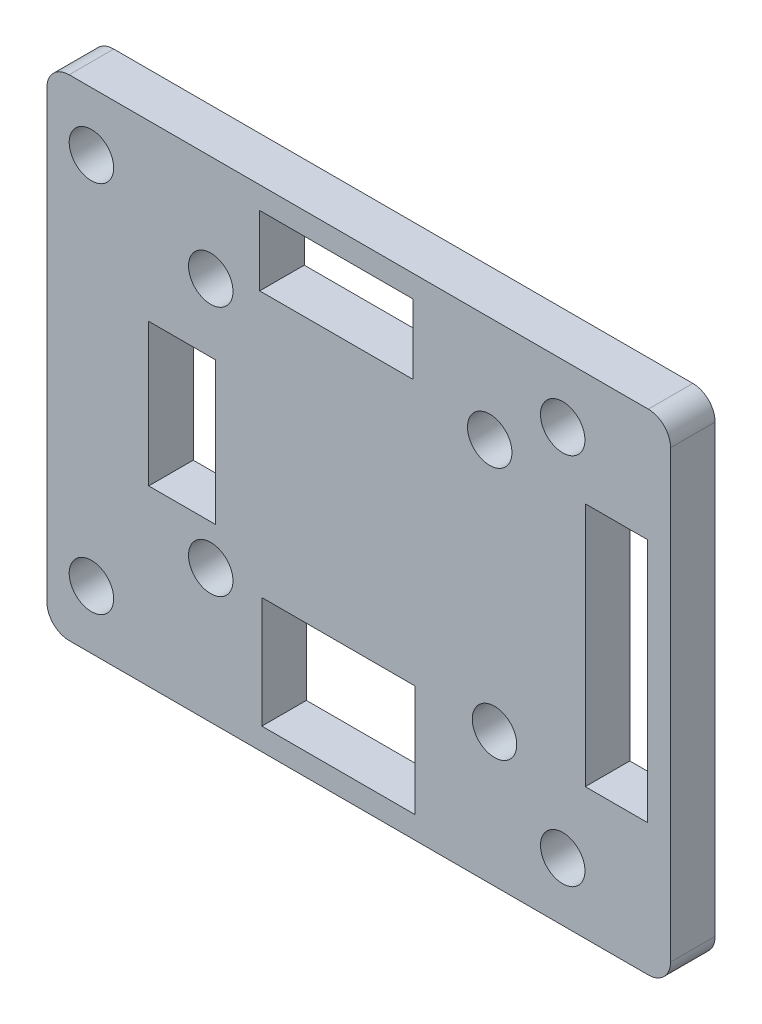
ISO-10303-21;
HEADER;
FILE_DESCRIPTION(('STEP AP214'),'2;1');
FILE_NAME('part.step','',(''),(''),'','','');
FILE_SCHEMA(('AUTOMOTIVE_DESIGN { 1 0 10303 214 1 1 1 1 }'));
ENDSEC;
DATA;
#1=APPLICATION_CONTEXT('core data for automotive mechanical design processes');
#2=APPLICATION_PROTOCOL_DEFINITION('international standard','automotive_design',2000,#1);
#3=PRODUCT_CONTEXT('',#1,'mechanical');
#4=PRODUCT('Part','Part','',(#3));
#5=PRODUCT_RELATED_PRODUCT_CATEGORY('part','',(#4));
#6=PRODUCT_DEFINITION_FORMATION('','',#4);
#7=PRODUCT_DEFINITION_CONTEXT('part definition',#1,'design');
#8=PRODUCT_DEFINITION('design','',#6,#7);
#9=PRODUCT_DEFINITION_SHAPE('','',#8);
#10=(LENGTH_UNIT() NAMED_UNIT(*) SI_UNIT(.MILLI.,.METRE.));
#11=(NAMED_UNIT(*) PLANE_ANGLE_UNIT() SI_UNIT($,.RADIAN.));
#12=(NAMED_UNIT(*) SI_UNIT($,.STERADIAN.) SOLID_ANGLE_UNIT());
#13=UNCERTAINTY_MEASURE_WITH_UNIT(LENGTH_MEASURE(1.E-05),#10,'distance_accuracy_value','');
#14=(GEOMETRIC_REPRESENTATION_CONTEXT(3) GLOBAL_UNCERTAINTY_ASSIGNED_CONTEXT((#13)) GLOBAL_UNIT_ASSIGNED_CONTEXT((#10,
#11,#12)) REPRESENTATION_CONTEXT('',''));
#15=CARTESIAN_POINT('',(0.,0.,0.));
#16=DIRECTION('',(0.,0.,1.));
#17=DIRECTION('',(1.,0.,0.));
#18=AXIS2_PLACEMENT_3D('',#15,#16,#17);
#19=CARTESIAN_POINT('',(0.,0.,2.54));
#20=DIRECTION('',(0.,0.,-1.));
#21=DIRECTION('',(-1.,0.,0.));
#22=AXIS2_PLACEMENT_3D('',#19,#20,#21);
#23=PLANE('',#22);
#24=DIRECTION('',(1.,0.,0.));
#25=VECTOR('',#24,1.);
#26=CARTESIAN_POINT('',(12.2564242404445,1.26999999999999,2.54));
#27=LINE('',#26,#25);
#28=CARTESIAN_POINT('',(12.2564242404445,1.26999999999999,2.54));
#29=VERTEX_POINT('',#28);
#30=CARTESIAN_POINT('',(20.9943307395216,1.26999999999999,2.54));
#31=VERTEX_POINT('',#30);
#32=EDGE_CURVE('E265',#29,#31,#27,.T.);
#33=ORIENTED_EDGE('',*,*,#32,.F.);
#34=DIRECTION('',(0.,-1.,0.));
#35=VECTOR('',#34,1.);
#36=CARTESIAN_POINT('',(12.2564242404445,7.61999999999998,2.54));
#37=LINE('',#36,#35);
#38=CARTESIAN_POINT('',(12.2564242404445,7.61999999999998,2.54));
#39=VERTEX_POINT('',#38);
#40=EDGE_CURVE('E276',#39,#29,#37,.T.);
#41=ORIENTED_EDGE('',*,*,#40,.F.);
#42=DIRECTION('',(-1.,0.,0.));
#43=VECTOR('',#42,1.);
#44=CARTESIAN_POINT('',(12.2564242404445,7.61999999999998,2.54));
#45=LINE('',#44,#43);
#46=CARTESIAN_POINT('',(20.9943307395216,7.61999999999998,2.54));
#47=VERTEX_POINT('',#46);
#48=EDGE_CURVE('E272',#47,#39,#45,.T.);
#49=ORIENTED_EDGE('',*,*,#48,.F.);
#50=DIRECTION('',(0.,1.,0.));
#51=VECTOR('',#50,1.);
#52=CARTESIAN_POINT('',(20.9943307395216,7.61999999999998,2.54));
#53=LINE('',#52,#51);
#54=EDGE_CURVE('E268',#31,#47,#53,.T.);
#55=ORIENTED_EDGE('',*,*,#54,.F.);
#56=EDGE_LOOP('',(#33,#41,#49,#55));
#57=FACE_BOUND('',#56,.T.);
#58=CARTESIAN_POINT('',(2.54,24.6087381577765,2.54));
#59=DIRECTION('',(0.,0.,1.));
#60=DIRECTION('',(1.,0.,0.));
#61=AXIS2_PLACEMENT_3D('',#58,#59,#60);
#62=CIRCLE('',#61,1.26751184222343);
#63=CARTESIAN_POINT('',(3.80751184222343,24.6087381577765,2.54));
#64=VERTEX_POINT('',#63);
#65=EDGE_CURVE('E351',#64,#64,#62,.T.);
#66=ORIENTED_EDGE('',*,*,#65,.F.);
#67=EDGE_LOOP('',(#66));
#68=FACE_BOUND('',#67,.T.);
#69=DIRECTION('',(1.,0.,0.));
#70=VECTOR('',#69,1.);
#71=CARTESIAN_POINT('',(34.2535356904248,7.50172230674273,2.54));
#72=LINE('',#71,#70);
#73=CARTESIAN_POINT('',(30.6975356904249,7.50172230674273,2.54));
#74=VERTEX_POINT('',#73);
#75=CARTESIAN_POINT('',(34.2535356904248,7.50172230674273,2.54));
#76=VERTEX_POINT('',#75);
#77=EDGE_CURVE('E359',#74,#76,#72,.T.);
#78=ORIENTED_EDGE('',*,*,#77,.F.);
#79=DIRECTION('',(0.,-1.,0.));
#80=VECTOR('',#79,1.);
#81=CARTESIAN_POINT('',(30.6975356904249,21.4717223067427,2.54));
#82=LINE('',#81,#80);
#83=CARTESIAN_POINT('',(30.6975356904249,21.4717223067427,2.54));
#84=VERTEX_POINT('',#83);
#85=EDGE_CURVE('E370',#84,#74,#82,.T.);
#86=ORIENTED_EDGE('',*,*,#85,.F.);
#87=DIRECTION('',(-1.,0.,0.));
#88=VECTOR('',#87,1.);
#89=CARTESIAN_POINT('',(30.6975356904249,21.4717223067427,2.54));
#90=LINE('',#89,#88);
#91=CARTESIAN_POINT('',(34.2535356904248,21.4717223067427,2.54));
#92=VERTEX_POINT('',#91);
#93=EDGE_CURVE('E366',#92,#84,#90,.T.);
#94=ORIENTED_EDGE('',*,*,#93,.F.);
#95=DIRECTION('',(0.,1.,0.));
#96=VECTOR('',#95,1.);
#97=CARTESIAN_POINT('',(34.2535356904248,21.4717223067427,2.54));
#98=LINE('',#97,#96);
#99=EDGE_CURVE('E362',#76,#92,#98,.T.);
#100=ORIENTED_EDGE('',*,*,#99,.F.);
#101=EDGE_LOOP('',(#78,#86,#94,#100));
#102=FACE_BOUND('',#101,.T.);
#103=DIRECTION('',(0.,1.,0.));
#104=VECTOR('',#103,1.);
#105=CARTESIAN_POINT('',(35.56,0.,2.54));
#106=LINE('',#105,#104);
#107=CARTESIAN_POINT('',(35.56,1.27,2.54));
#108=VERTEX_POINT('',#107);
#109=CARTESIAN_POINT('',(35.56,26.67,2.54));
#110=VERTEX_POINT('',#109);
#111=EDGE_CURVE('E409',#108,#110,#106,.T.);
#112=ORIENTED_EDGE('',*,*,#111,.T.);
#113=CARTESIAN_POINT('',(34.29,26.67,2.54));
#114=DIRECTION('',(0.,0.,-1.));
#115=DIRECTION('',(-1.,0.,0.));
#116=AXIS2_PLACEMENT_3D('',#113,#114,#115);
#117=CIRCLE('',#116,1.27);
#118=CARTESIAN_POINT('',(34.29,27.94,2.54));
#119=VERTEX_POINT('',#118);
#120=EDGE_CURVE('E464',#110,#119,#117,.F.);
#121=ORIENTED_EDGE('',*,*,#120,.T.);
#122=DIRECTION('',(-1.,0.,0.));
#123=VECTOR('',#122,1.);
#124=CARTESIAN_POINT('',(0.,27.94,2.54));
#125=LINE('',#124,#123);
#126=CARTESIAN_POINT('',(1.27,27.94,2.54));
#127=VERTEX_POINT('',#126);
#128=EDGE_CURVE('E413',#119,#127,#125,.T.);
#129=ORIENTED_EDGE('',*,*,#128,.T.);
#130=CARTESIAN_POINT('',(1.27,26.67,2.54));
#131=DIRECTION('',(0.,0.,-1.));
#132=DIRECTION('',(-1.,0.,0.));
#133=AXIS2_PLACEMENT_3D('',#130,#131,#132);
#134=CIRCLE('',#133,1.27);
#135=CARTESIAN_POINT('',(0.,26.67,2.54));
#136=VERTEX_POINT('',#135);
#137=EDGE_CURVE('E456',#127,#136,#134,.F.);
#138=ORIENTED_EDGE('',*,*,#137,.T.);
#139=DIRECTION('',(0.,-1.,0.));
#140=VECTOR('',#139,1.);
#141=CARTESIAN_POINT('',(0.,0.,2.54));
#142=LINE('',#141,#140);
#143=CARTESIAN_POINT('',(0.,1.27,2.54));
#144=VERTEX_POINT('',#143);
#145=EDGE_CURVE('E402',#136,#144,#142,.T.);
#146=ORIENTED_EDGE('',*,*,#145,.T.);
#147=CARTESIAN_POINT('',(1.27,1.27,2.54));
#148=DIRECTION('',(0.,0.,-1.));
#149=DIRECTION('',(-1.,0.,0.));
#150=AXIS2_PLACEMENT_3D('',#147,#148,#149);
#151=CIRCLE('',#150,1.27);
#152=CARTESIAN_POINT('',(1.27,0.,2.54));
#153=VERTEX_POINT('',#152);
#154=EDGE_CURVE('E68',#144,#153,#151,.F.);
#155=ORIENTED_EDGE('',*,*,#154,.T.);
#156=DIRECTION('',(1.,0.,0.));
#157=VECTOR('',#156,1.);
#158=CARTESIAN_POINT('',(0.,0.,2.54));
#159=LINE('',#158,#157);
#160=CARTESIAN_POINT('',(34.29,0.,2.54));
#161=VERTEX_POINT('',#160);
#162=EDGE_CURVE('E405',#153,#161,#159,.T.);
#163=ORIENTED_EDGE('',*,*,#162,.T.);
#164=CARTESIAN_POINT('',(34.29,1.27,2.54));
#165=DIRECTION('',(0.,0.,-1.));
#166=DIRECTION('',(-1.,0.,0.));
#167=AXIS2_PLACEMENT_3D('',#164,#165,#166);
#168=CIRCLE('',#167,1.27);
#169=EDGE_CURVE('E461',#161,#108,#168,.F.);
#170=ORIENTED_EDGE('',*,*,#169,.T.);
#171=EDGE_LOOP('',(#112,#121,#129,#138,#146,#155,#163,#170));
#172=FACE_BOUND('',#171,.T.);
#173=DIRECTION('',(0.,-1.,0.));
#174=VECTOR('',#173,1.);
#175=CARTESIAN_POINT('',(5.80594139998284,9.906,2.54));
#176=LINE('',#175,#174);
#177=CARTESIAN_POINT('',(5.80594139998284,18.034,2.54));
#178=VERTEX_POINT('',#177);
#179=CARTESIAN_POINT('',(5.80594139998284,9.906,2.54));
#180=VERTEX_POINT('',#179);
#181=EDGE_CURVE('E308',#178,#180,#176,.T.);
#182=ORIENTED_EDGE('',*,*,#181,.F.);
#183=DIRECTION('',(-1.,0.,0.));
#184=VECTOR('',#183,1.);
#185=CARTESIAN_POINT('',(5.80594139998284,18.034,2.54));
#186=LINE('',#185,#184);
#187=CARTESIAN_POINT('',(9.61594139998284,18.034,2.54));
#188=VERTEX_POINT('',#187);
#189=EDGE_CURVE('E319',#188,#178,#186,.T.);
#190=ORIENTED_EDGE('',*,*,#189,.F.);
#191=DIRECTION('',(0.,1.,0.));
#192=VECTOR('',#191,1.);
#193=CARTESIAN_POINT('',(9.61594139998284,18.034,2.54));
#194=LINE('',#193,#192);
#195=CARTESIAN_POINT('',(9.61594139998284,9.906,2.54));
#196=VERTEX_POINT('',#195);
#197=EDGE_CURVE('E315',#196,#188,#194,.T.);
#198=ORIENTED_EDGE('',*,*,#197,.F.);
#199=DIRECTION('',(1.,0.,0.));
#200=VECTOR('',#199,1.);
#201=CARTESIAN_POINT('',(9.61594139998284,9.906,2.54));
#202=LINE('',#201,#200);
#203=EDGE_CURVE('E311',#180,#196,#202,.T.);
#204=ORIENTED_EDGE('',*,*,#203,.F.);
#205=EDGE_LOOP('',(#182,#190,#198,#204));
#206=FACE_BOUND('',#205,.T.);
#207=DIRECTION('',(-1.,0.,0.));
#208=VECTOR('',#207,1.);
#209=CARTESIAN_POINT('',(12.1360807395216,26.67,2.54));
#210=LINE('',#209,#208);
#211=CARTESIAN_POINT('',(20.8673307395216,26.67,2.54));
#212=VERTEX_POINT('',#211);
#213=CARTESIAN_POINT('',(12.1360807395216,26.67,2.54));
#214=VERTEX_POINT('',#213);
#215=EDGE_CURVE('E209',#212,#214,#210,.T.);
#216=ORIENTED_EDGE('',*,*,#215,.F.);
#217=DIRECTION('',(0.,1.,0.));
#218=VECTOR('',#217,1.);
#219=CARTESIAN_POINT('',(20.8673307395216,26.67,2.54));
#220=LINE('',#219,#218);
#221=CARTESIAN_POINT('',(20.8673307395216,22.70125,2.54));
#222=VERTEX_POINT('',#221);
#223=EDGE_CURVE('E239',#222,#212,#220,.T.);
#224=ORIENTED_EDGE('',*,*,#223,.F.);
#225=DIRECTION('',(1.,0.,0.));
#226=VECTOR('',#225,1.);
#227=CARTESIAN_POINT('',(12.1360807395216,22.70125,2.54));
#228=LINE('',#227,#226);
#229=CARTESIAN_POINT('',(12.1360807395216,22.70125,2.54));
#230=VERTEX_POINT('',#229);
#231=EDGE_CURVE('E235',#230,#222,#228,.T.);
#232=ORIENTED_EDGE('',*,*,#231,.F.);
#233=DIRECTION('',(0.,-1.,0.));
#234=VECTOR('',#233,1.);
#235=CARTESIAN_POINT('',(12.1360807395216,26.67,2.54));
#236=LINE('',#235,#234);
#237=EDGE_CURVE('E220',#214,#230,#236,.T.);
#238=ORIENTED_EDGE('',*,*,#237,.F.);
#239=EDGE_LOOP('',(#216,#224,#232,#238));
#240=FACE_BOUND('',#239,.T.);
#241=CARTESIAN_POINT('',(25.2488307395216,21.9075,2.54));
#242=DIRECTION('',(0.,0.,1.));
#243=DIRECTION('',(-1.,0.,0.));
#244=AXIS2_PLACEMENT_3D('',#241,#242,#243);
#245=CIRCLE('',#244,1.26751184222344);
#246=CARTESIAN_POINT('',(23.9813188972981,21.9075,2.54));
#247=VERTEX_POINT('',#246);
#248=EDGE_CURVE('E248',#247,#247,#245,.T.);
#249=ORIENTED_EDGE('',*,*,#248,.F.);
#250=EDGE_LOOP('',(#249));
#251=FACE_BOUND('',#250,.T.);
#252=CARTESIAN_POINT('',(9.34208073952158,21.9075,2.54));
#253=DIRECTION('',(0.,0.,1.));
#254=DIRECTION('',(1.,0.,0.));
#255=AXIS2_PLACEMENT_3D('',#252,#253,#254);
#256=CIRCLE('',#255,1.26751184222344);
#257=CARTESIAN_POINT('',(10.609592581745,21.9075,2.54));
#258=VERTEX_POINT('',#257);
#259=EDGE_CURVE('E890',#258,#258,#256,.T.);
#260=ORIENTED_EDGE('',*,*,#259,.F.);
#261=EDGE_LOOP('',(#260));
#262=FACE_BOUND('',#261,.T.);
#263=CARTESIAN_POINT('',(29.4105688972981,24.6087381577765,2.54));
#264=DIRECTION('',(0.,0.,1.));
#265=DIRECTION('',(-1.,0.,0.));
#266=AXIS2_PLACEMENT_3D('',#263,#264,#265);
#267=CIRCLE('',#266,1.26751184222341);
#268=CARTESIAN_POINT('',(28.1430570550747,24.6087381577765,2.54));
#269=VERTEX_POINT('',#268);
#270=EDGE_CURVE('E883',#269,#269,#267,.T.);
#271=ORIENTED_EDGE('',*,*,#270,.F.);
#272=EDGE_LOOP('',(#271));
#273=FACE_BOUND('',#272,.T.);
#274=CARTESIAN_POINT('',(9.34208073952158,7.62,2.54));
#275=DIRECTION('',(0.,0.,1.));
#276=DIRECTION('',(1.,0.,0.));
#277=AXIS2_PLACEMENT_3D('',#274,#275,#276);
#278=CIRCLE('',#277,1.26751184222344);
#279=CARTESIAN_POINT('',(10.609592581745,7.62,2.54));
#280=VERTEX_POINT('',#279);
#281=EDGE_CURVE('E876',#280,#280,#278,.T.);
#282=ORIENTED_EDGE('',*,*,#281,.F.);
#283=EDGE_LOOP('',(#282));
#284=FACE_BOUND('',#283,.T.);
#285=CARTESIAN_POINT('',(2.54000000000001,3.33126184222345,2.54));
#286=DIRECTION('',(0.,0.,1.));
#287=DIRECTION('',(1.,0.,0.));
#288=AXIS2_PLACEMENT_3D('',#285,#286,#287);
#289=CIRCLE('',#288,1.26751184222344);
#290=CARTESIAN_POINT('',(3.80751184222345,3.33126184222345,2.54));
#291=VERTEX_POINT('',#290);
#292=EDGE_CURVE('E869',#291,#291,#289,.T.);
#293=ORIENTED_EDGE('',*,*,#292,.F.);
#294=EDGE_LOOP('',(#293));
#295=FACE_BOUND('',#294,.T.);
#296=CARTESIAN_POINT('',(29.4105688972981,3.33126184222345,2.54));
#297=DIRECTION('',(0.,0.,1.));
#298=DIRECTION('',(1.,0.,0.));
#299=AXIS2_PLACEMENT_3D('',#296,#297,#298);
#300=CIRCLE('',#299,1.26751184222341);
#301=CARTESIAN_POINT('',(30.6780807395216,3.33126184222345,2.54));
#302=VERTEX_POINT('',#301);
#303=EDGE_CURVE('E862',#302,#302,#300,.T.);
#304=ORIENTED_EDGE('',*,*,#303,.F.);
#305=EDGE_LOOP('',(#304));
#306=FACE_BOUND('',#305,.T.);
#307=CARTESIAN_POINT('',(25.5222856904249,7.62,2.54));
#308=DIRECTION('',(0.,0.,1.));
#309=DIRECTION('',(1.,0.,0.));
#310=AXIS2_PLACEMENT_3D('',#307,#308,#309);
#311=CIRCLE('',#310,1.26751184222344);
#312=CARTESIAN_POINT('',(26.7897975326484,7.62,2.54));
#313=VERTEX_POINT('',#312);
#314=EDGE_CURVE('E855',#313,#313,#311,.T.);
#315=ORIENTED_EDGE('',*,*,#314,.F.);
#316=EDGE_LOOP('',(#315));
#317=FACE_BOUND('',#316,.T.);
#318=ADVANCED_FACE('F45',(#57,#68,#102,#172,#206,#240,#251,#262,#273,#284,#295,#306,#317),#23,.F.);
#319=CARTESIAN_POINT('',(0.,0.,0.));
#320=DIRECTION('',(0.,0.,-1.));
#321=DIRECTION('',(-1.,0.,0.));
#322=AXIS2_PLACEMENT_3D('',#319,#320,#321);
#323=PLANE('',#322);
#324=CARTESIAN_POINT('',(29.4105688972981,3.33126184222345,0.));
#325=DIRECTION('',(0.,0.,1.));
#326=DIRECTION('',(1.,0.,0.));
#327=AXIS2_PLACEMENT_3D('',#324,#325,#326);
#328=CIRCLE('',#327,1.26751184222341);
#329=CARTESIAN_POINT('',(30.6780807395216,3.33126184222345,0.));
#330=VERTEX_POINT('',#329);
#331=EDGE_CURVE('E859',#330,#330,#328,.T.);
#332=ORIENTED_EDGE('',*,*,#331,.T.);
#333=EDGE_LOOP('',(#332));
#334=FACE_BOUND('',#333,.T.);
#335=CARTESIAN_POINT('',(9.34208073952158,7.62,0.));
#336=DIRECTION('',(0.,0.,1.));
#337=DIRECTION('',(1.,0.,0.));
#338=AXIS2_PLACEMENT_3D('',#335,#336,#337);
#339=CIRCLE('',#338,1.26751184222344);
#340=CARTESIAN_POINT('',(10.609592581745,7.62,0.));
#341=VERTEX_POINT('',#340);
#342=EDGE_CURVE('E873',#341,#341,#339,.T.);
#343=ORIENTED_EDGE('',*,*,#342,.T.);
#344=EDGE_LOOP('',(#343));
#345=FACE_BOUND('',#344,.T.);
#346=CARTESIAN_POINT('',(9.34208073952158,21.9075,0.));
#347=DIRECTION('',(0.,0.,1.));
#348=DIRECTION('',(1.,0.,0.));
#349=AXIS2_PLACEMENT_3D('',#346,#347,#348);
#350=CIRCLE('',#349,1.26751184222344);
#351=CARTESIAN_POINT('',(10.609592581745,21.9075,0.));
#352=VERTEX_POINT('',#351);
#353=EDGE_CURVE('E887',#352,#352,#350,.T.);
#354=ORIENTED_EDGE('',*,*,#353,.T.);
#355=EDGE_LOOP('',(#354));
#356=FACE_BOUND('',#355,.T.);
#357=DIRECTION('',(0.,1.,0.));
#358=VECTOR('',#357,1.);
#359=CARTESIAN_POINT('',(20.8673307395216,26.67,0.));
#360=LINE('',#359,#358);
#361=CARTESIAN_POINT('',(20.8673307395216,22.70125,0.));
#362=VERTEX_POINT('',#361);
#363=CARTESIAN_POINT('',(20.8673307395216,26.67,0.));
#364=VERTEX_POINT('',#363);
#365=EDGE_CURVE('E221',#362,#364,#360,.T.);
#366=ORIENTED_EDGE('',*,*,#365,.T.);
#367=DIRECTION('',(-1.,0.,0.));
#368=VECTOR('',#367,1.);
#369=CARTESIAN_POINT('',(12.1360807395216,26.67,0.));
#370=LINE('',#369,#368);
#371=CARTESIAN_POINT('',(12.1360807395216,26.67,0.));
#372=VERTEX_POINT('',#371);
#373=EDGE_CURVE('E245',#364,#372,#370,.T.);
#374=ORIENTED_EDGE('',*,*,#373,.T.);
#375=DIRECTION('',(0.,-1.,0.));
#376=VECTOR('',#375,1.);
#377=CARTESIAN_POINT('',(12.1360807395216,26.67,0.));
#378=LINE('',#377,#376);
#379=CARTESIAN_POINT('',(12.1360807395216,22.70125,0.));
#380=VERTEX_POINT('',#379);
#381=EDGE_CURVE('E227',#372,#380,#378,.T.);
#382=ORIENTED_EDGE('',*,*,#381,.T.);
#383=DIRECTION('',(1.,0.,0.));
#384=VECTOR('',#383,1.);
#385=CARTESIAN_POINT('',(12.1360807395216,22.70125,0.));
#386=LINE('',#385,#384);
#387=EDGE_CURVE('E251',#380,#362,#386,.T.);
#388=ORIENTED_EDGE('',*,*,#387,.T.);
#389=EDGE_LOOP('',(#366,#374,#382,#388));
#390=FACE_BOUND('',#389,.T.);
#391=DIRECTION('',(0.,-1.,0.));
#392=VECTOR('',#391,1.);
#393=CARTESIAN_POINT('',(12.2564242404445,7.61999999999998,0.));
#394=LINE('',#393,#392);
#395=CARTESIAN_POINT('',(12.2564242404445,7.61999999999998,0.));
#396=VERTEX_POINT('',#395);
#397=CARTESIAN_POINT('',(12.2564242404445,1.26999999999999,0.));
#398=VERTEX_POINT('',#397);
#399=EDGE_CURVE('E269',#396,#398,#394,.T.);
#400=ORIENTED_EDGE('',*,*,#399,.T.);
#401=DIRECTION('',(1.,0.,0.));
#402=VECTOR('',#401,1.);
#403=CARTESIAN_POINT('',(12.2564242404445,1.26999999999999,0.));
#404=LINE('',#403,#402);
#405=CARTESIAN_POINT('',(20.9943307395216,1.26999999999999,0.));
#406=VERTEX_POINT('',#405);
#407=EDGE_CURVE('E229',#398,#406,#404,.T.);
#408=ORIENTED_EDGE('',*,*,#407,.T.);
#409=DIRECTION('',(0.,1.,0.));
#410=VECTOR('',#409,1.);
#411=CARTESIAN_POINT('',(20.9943307395216,7.61999999999998,0.));
#412=LINE('',#411,#410);
#413=CARTESIAN_POINT('',(20.9943307395216,7.61999999999998,0.));
#414=VERTEX_POINT('',#413);
#415=EDGE_CURVE('E283',#406,#414,#412,.T.);
#416=ORIENTED_EDGE('',*,*,#415,.T.);
#417=DIRECTION('',(-1.,0.,0.));
#418=VECTOR('',#417,1.);
#419=CARTESIAN_POINT('',(12.2564242404445,7.61999999999998,0.));
#420=LINE('',#419,#418);
#421=EDGE_CURVE('E287',#414,#396,#420,.T.);
#422=ORIENTED_EDGE('',*,*,#421,.T.);
#423=EDGE_LOOP('',(#400,#408,#416,#422));
#424=FACE_BOUND('',#423,.T.);
#425=DIRECTION('',(-1.,0.,0.));
#426=VECTOR('',#425,1.);
#427=CARTESIAN_POINT('',(5.80594139998284,18.034,0.));
#428=LINE('',#427,#426);
#429=CARTESIAN_POINT('',(9.61594139998284,18.034,0.));
#430=VERTEX_POINT('',#429);
#431=CARTESIAN_POINT('',(5.80594139998284,18.034,0.));
#432=VERTEX_POINT('',#431);
#433=EDGE_CURVE('E312',#430,#432,#428,.T.);
#434=ORIENTED_EDGE('',*,*,#433,.T.);
#435=DIRECTION('',(0.,-1.,0.));
#436=VECTOR('',#435,1.);
#437=CARTESIAN_POINT('',(5.80594139998284,9.906,0.));
#438=LINE('',#437,#436);
#439=CARTESIAN_POINT('',(5.80594139998284,9.906,0.));
#440=VERTEX_POINT('',#439);
#441=EDGE_CURVE('E307',#432,#440,#438,.T.);
#442=ORIENTED_EDGE('',*,*,#441,.T.);
#443=DIRECTION('',(1.,0.,0.));
#444=VECTOR('',#443,1.);
#445=CARTESIAN_POINT('',(9.61594139998284,9.906,0.));
#446=LINE('',#445,#444);
#447=CARTESIAN_POINT('',(9.61594139998284,9.906,0.));
#448=VERTEX_POINT('',#447);
#449=EDGE_CURVE('E326',#440,#448,#446,.T.);
#450=ORIENTED_EDGE('',*,*,#449,.T.);
#451=DIRECTION('',(0.,1.,0.));
#452=VECTOR('',#451,1.);
#453=CARTESIAN_POINT('',(9.61594139998284,18.034,0.));
#454=LINE('',#453,#452);
#455=EDGE_CURVE('E330',#448,#430,#454,.T.);
#456=ORIENTED_EDGE('',*,*,#455,.T.);
#457=EDGE_LOOP('',(#434,#442,#450,#456));
#458=FACE_BOUND('',#457,.T.);
#459=CARTESIAN_POINT('',(2.54,24.6087381577765,0.));
#460=DIRECTION('',(0.,0.,1.));
#461=DIRECTION('',(1.,0.,0.));
#462=AXIS2_PLACEMENT_3D('',#459,#460,#461);
#463=CIRCLE('',#462,1.26751184222343);
#464=CARTESIAN_POINT('',(3.80751184222343,24.6087381577765,0.));
#465=VERTEX_POINT('',#464);
#466=EDGE_CURVE('E350',#465,#465,#463,.T.);
#467=ORIENTED_EDGE('',*,*,#466,.T.);
#468=EDGE_LOOP('',(#467));
#469=FACE_BOUND('',#468,.T.);
#470=DIRECTION('',(-1.,0.,0.));
#471=VECTOR('',#470,1.);
#472=CARTESIAN_POINT('',(0.,27.94,0.));
#473=LINE('',#472,#471);
#474=CARTESIAN_POINT('',(34.29,27.94,0.));
#475=VERTEX_POINT('',#474);
#476=CARTESIAN_POINT('',(1.27,27.94,0.));
#477=VERTEX_POINT('',#476);
#478=EDGE_CURVE('E406',#475,#477,#473,.T.);
#479=ORIENTED_EDGE('',*,*,#478,.F.);
#480=CARTESIAN_POINT('',(34.29,26.67,0.));
#481=DIRECTION('',(0.,0.,-1.));
#482=DIRECTION('',(-1.,0.,0.));
#483=AXIS2_PLACEMENT_3D('',#480,#481,#482);
#484=CIRCLE('',#483,1.27);
#485=CARTESIAN_POINT('',(35.56,26.67,0.));
#486=VERTEX_POINT('',#485);
#487=EDGE_CURVE('E446',#475,#486,#484,.T.);
#488=ORIENTED_EDGE('',*,*,#487,.T.);
#489=DIRECTION('',(0.,1.,0.));
#490=VECTOR('',#489,1.);
#491=CARTESIAN_POINT('',(35.56,0.,0.));
#492=LINE('',#491,#490);
#493=CARTESIAN_POINT('',(35.56,1.27,0.));
#494=VERTEX_POINT('',#493);
#495=EDGE_CURVE('E424',#494,#486,#492,.T.);
#496=ORIENTED_EDGE('',*,*,#495,.F.);
#497=CARTESIAN_POINT('',(34.29,1.27,0.));
#498=DIRECTION('',(0.,0.,-1.));
#499=DIRECTION('',(-1.,0.,0.));
#500=AXIS2_PLACEMENT_3D('',#497,#498,#499);
#501=CIRCLE('',#500,1.27);
#502=CARTESIAN_POINT('',(34.29,0.,0.));
#503=VERTEX_POINT('',#502);
#504=EDGE_CURVE('E443',#494,#503,#501,.T.);
#505=ORIENTED_EDGE('',*,*,#504,.T.);
#506=DIRECTION('',(1.,0.,0.));
#507=VECTOR('',#506,1.);
#508=CARTESIAN_POINT('',(0.,0.,0.));
#509=LINE('',#508,#507);
#510=CARTESIAN_POINT('',(1.27,0.,0.));
#511=VERTEX_POINT('',#510);
#512=EDGE_CURVE('E421',#511,#503,#509,.T.);
#513=ORIENTED_EDGE('',*,*,#512,.F.);
#514=CARTESIAN_POINT('',(1.27,1.27,0.));
#515=DIRECTION('',(0.,0.,-1.));
#516=DIRECTION('',(-1.,0.,0.));
#517=AXIS2_PLACEMENT_3D('',#514,#515,#516);
#518=CIRCLE('',#517,1.27);
#519=CARTESIAN_POINT('',(0.,1.27,0.));
#520=VERTEX_POINT('',#519);
#521=EDGE_CURVE('E440',#511,#520,#518,.T.);
#522=ORIENTED_EDGE('',*,*,#521,.T.);
#523=DIRECTION('',(0.,-1.,0.));
#524=VECTOR('',#523,1.);
#525=CARTESIAN_POINT('',(0.,0.,0.));
#526=LINE('',#525,#524);
#527=CARTESIAN_POINT('',(0.,26.67,0.));
#528=VERTEX_POINT('',#527);
#529=EDGE_CURVE('E401',#528,#520,#526,.T.);
#530=ORIENTED_EDGE('',*,*,#529,.F.);
#531=CARTESIAN_POINT('',(1.27,26.67,0.));
#532=DIRECTION('',(0.,0.,-1.));
#533=DIRECTION('',(-1.,0.,0.));
#534=AXIS2_PLACEMENT_3D('',#531,#532,#533);
#535=CIRCLE('',#534,1.27);
#536=EDGE_CURVE('E437',#528,#477,#535,.T.);
#537=ORIENTED_EDGE('',*,*,#536,.T.);
#538=EDGE_LOOP('',(#479,#488,#496,#505,#513,#522,#530,#537));
#539=FACE_BOUND('',#538,.T.);
#540=DIRECTION('',(0.,-1.,0.));
#541=VECTOR('',#540,1.);
#542=CARTESIAN_POINT('',(30.6975356904249,21.4717223067427,0.));
#543=LINE('',#542,#541);
#544=CARTESIAN_POINT('',(30.6975356904249,21.4717223067427,0.));
#545=VERTEX_POINT('',#544);
#546=CARTESIAN_POINT('',(30.6975356904249,7.50172230674273,0.));
#547=VERTEX_POINT('',#546);
#548=EDGE_CURVE('E363',#545,#547,#543,.T.);
#549=ORIENTED_EDGE('',*,*,#548,.T.);
#550=DIRECTION('',(1.,0.,0.));
#551=VECTOR('',#550,1.);
#552=CARTESIAN_POINT('',(34.2535356904248,7.50172230674273,0.));
#553=LINE('',#552,#551);
#554=CARTESIAN_POINT('',(34.2535356904248,7.50172230674273,0.));
#555=VERTEX_POINT('',#554);
#556=EDGE_CURVE('E355',#547,#555,#553,.T.);
#557=ORIENTED_EDGE('',*,*,#556,.T.);
#558=DIRECTION('',(0.,1.,0.));
#559=VECTOR('',#558,1.);
#560=CARTESIAN_POINT('',(34.2535356904248,21.4717223067427,0.));
#561=LINE('',#560,#559);
#562=CARTESIAN_POINT('',(34.2535356904248,21.4717223067427,0.));
#563=VERTEX_POINT('',#562);
#564=EDGE_CURVE('E377',#555,#563,#561,.T.);
#565=ORIENTED_EDGE('',*,*,#564,.T.);
#566=DIRECTION('',(-1.,0.,0.));
#567=VECTOR('',#566,1.);
#568=CARTESIAN_POINT('',(30.6975356904249,21.4717223067427,0.));
#569=LINE('',#568,#567);
#570=EDGE_CURVE('E381',#563,#545,#569,.T.);
#571=ORIENTED_EDGE('',*,*,#570,.T.);
#572=EDGE_LOOP('',(#549,#557,#565,#571));
#573=FACE_BOUND('',#572,.T.);
#574=CARTESIAN_POINT('',(25.2488307395216,21.9075,0.));
#575=DIRECTION('',(0.,0.,1.));
#576=DIRECTION('',(-1.,0.,0.));
#577=AXIS2_PLACEMENT_3D('',#574,#575,#576);
#578=CIRCLE('',#577,1.26751184222344);
#579=CARTESIAN_POINT('',(23.9813188972981,21.9075,0.));
#580=VERTEX_POINT('',#579);
#581=EDGE_CURVE('E841',#580,#580,#578,.T.);
#582=ORIENTED_EDGE('',*,*,#581,.T.);
#583=EDGE_LOOP('',(#582));
#584=FACE_BOUND('',#583,.T.);
#585=CARTESIAN_POINT('',(29.4105688972981,24.6087381577765,0.));
#586=DIRECTION('',(0.,0.,1.));
#587=DIRECTION('',(-1.,0.,0.));
#588=AXIS2_PLACEMENT_3D('',#585,#586,#587);
#589=CIRCLE('',#588,1.26751184222341);
#590=CARTESIAN_POINT('',(28.1430570550747,24.6087381577765,0.));
#591=VERTEX_POINT('',#590);
#592=EDGE_CURVE('E845',#591,#591,#589,.T.);
#593=ORIENTED_EDGE('',*,*,#592,.T.);
#594=EDGE_LOOP('',(#593));
#595=FACE_BOUND('',#594,.T.);
#596=CARTESIAN_POINT('',(2.54000000000001,3.33126184222345,0.));
#597=DIRECTION('',(0.,0.,1.));
#598=DIRECTION('',(1.,0.,0.));
#599=AXIS2_PLACEMENT_3D('',#596,#597,#598);
#600=CIRCLE('',#599,1.26751184222344);
#601=CARTESIAN_POINT('',(3.80751184222345,3.33126184222345,0.));
#602=VERTEX_POINT('',#601);
#603=EDGE_CURVE('E849',#602,#602,#600,.T.);
#604=ORIENTED_EDGE('',*,*,#603,.T.);
#605=EDGE_LOOP('',(#604));
#606=FACE_BOUND('',#605,.T.);
#607=CARTESIAN_POINT('',(25.5222856904249,7.62,0.));
#608=DIRECTION('',(0.,0.,1.));
#609=DIRECTION('',(1.,0.,0.));
#610=AXIS2_PLACEMENT_3D('',#607,#608,#609);
#611=CIRCLE('',#610,1.26751184222344);
#612=CARTESIAN_POINT('',(26.7897975326484,7.62,0.));
#613=VERTEX_POINT('',#612);
#614=EDGE_CURVE('E852',#613,#613,#611,.T.);
#615=ORIENTED_EDGE('',*,*,#614,.T.);
#616=EDGE_LOOP('',(#615));
#617=FACE_BOUND('',#616,.T.);
#618=ADVANCED_FACE('F484',(#334,#345,#356,#390,#424,#458,#469,#539,#573,#584,#595,#606,#617),
#323,.T.);
#619=CARTESIAN_POINT('',(0.,0.,2.54));
#620=DIRECTION('',(1.,0.,0.));
#621=DIRECTION('',(0.,0.,-1.));
#622=AXIS2_PLACEMENT_3D('',#619,#620,#621);
#623=PLANE('',#622);
#624=ORIENTED_EDGE('',*,*,#529,.T.);
#625=DIRECTION('',(0.,0.,-1.));
#626=VECTOR('',#625,1.);
#627=CARTESIAN_POINT('',(0.,1.27,2.54));
#628=LINE('',#627,#626);
#629=EDGE_CURVE('E11',#520,#144,#628,.F.);
#630=ORIENTED_EDGE('',*,*,#629,.T.);
#631=ORIENTED_EDGE('',*,*,#145,.F.);
#632=DIRECTION('',(0.,0.,-1.));
#633=VECTOR('',#632,1.);
#634=CARTESIAN_POINT('',(0.,26.67,2.54));
#635=LINE('',#634,#633);
#636=EDGE_CURVE('E54',#136,#528,#635,.T.);
#637=ORIENTED_EDGE('',*,*,#636,.T.);
#638=EDGE_LOOP('',(#624,#630,#631,#637));
#639=FACE_BOUND('',#638,.T.);
#640=ADVANCED_FACE('F478',(#639),#623,.F.);
#641=CARTESIAN_POINT('',(0.,0.,2.54));
#642=DIRECTION('',(0.,1.,0.));
#643=DIRECTION('',(-1.,0.,0.));
#644=AXIS2_PLACEMENT_3D('',#641,#642,#643);
#645=PLANE('',#644);
#646=ORIENTED_EDGE('',*,*,#512,.T.);
#647=DIRECTION('',(0.,0.,-1.));
#648=VECTOR('',#647,1.);
#649=CARTESIAN_POINT('',(34.29,0.,2.54));
#650=LINE('',#649,#648);
#651=EDGE_CURVE('E61',#503,#161,#650,.F.);
#652=ORIENTED_EDGE('',*,*,#651,.T.);
#653=ORIENTED_EDGE('',*,*,#162,.F.);
#654=DIRECTION('',(0.,0.,-1.));
#655=VECTOR('',#654,1.);
#656=CARTESIAN_POINT('',(1.27,0.,2.54));
#657=LINE('',#656,#655);
#658=EDGE_CURVE('E467',#153,#511,#657,.T.);
#659=ORIENTED_EDGE('',*,*,#658,.T.);
#660=EDGE_LOOP('',(#646,#652,#653,#659));
#661=FACE_BOUND('',#660,.T.);
#662=ADVANCED_FACE('F490',(#661),#645,.F.);
#663=CARTESIAN_POINT('',(35.56,0.,2.54));
#664=DIRECTION('',(-1.,0.,0.));
#665=DIRECTION('',(0.,0.,1.));
#666=AXIS2_PLACEMENT_3D('',#663,#664,#665);
#667=PLANE('',#666);
#668=ORIENTED_EDGE('',*,*,#495,.T.);
#669=DIRECTION('',(0.,0.,-1.));
#670=VECTOR('',#669,1.);
#671=CARTESIAN_POINT('',(35.56,26.67,2.54));
#672=LINE('',#671,#670);
#673=EDGE_CURVE('E453',#486,#110,#672,.F.);
#674=ORIENTED_EDGE('',*,*,#673,.T.);
#675=ORIENTED_EDGE('',*,*,#111,.F.);
#676=DIRECTION('',(0.,0.,-1.));
#677=VECTOR('',#676,1.);
#678=CARTESIAN_POINT('',(35.56,1.27,2.54));
#679=LINE('',#678,#677);
#680=EDGE_CURVE('E449',#108,#494,#679,.T.);
#681=ORIENTED_EDGE('',*,*,#680,.T.);
#682=EDGE_LOOP('',(#668,#674,#675,#681));
#683=FACE_BOUND('',#682,.T.);
#684=ADVANCED_FACE('F499',(#683),#667,.F.);
#685=CARTESIAN_POINT('',(0.,27.94,2.54));
#686=DIRECTION('',(0.,-1.,0.));
#687=DIRECTION('',(0.,0.,-1.));
#688=AXIS2_PLACEMENT_3D('',#685,#686,#687);
#689=PLANE('',#688);
#690=ORIENTED_EDGE('',*,*,#128,.F.);
#691=DIRECTION('',(0.,0.,-1.));
#692=VECTOR('',#691,1.);
#693=CARTESIAN_POINT('',(34.29,27.94,2.54));
#694=LINE('',#693,#692);
#695=EDGE_CURVE('E433',#119,#475,#694,.T.);
#696=ORIENTED_EDGE('',*,*,#695,.T.);
#697=ORIENTED_EDGE('',*,*,#478,.T.);
#698=DIRECTION('',(0.,0.,-1.));
#699=VECTOR('',#698,1.);
#700=CARTESIAN_POINT('',(1.27,27.94,2.54));
#701=LINE('',#700,#699);
#702=EDGE_CURVE('E417',#477,#127,#701,.F.);
#703=ORIENTED_EDGE('',*,*,#702,.T.);
#704=EDGE_LOOP('',(#690,#696,#697,#703));
#705=FACE_BOUND('',#704,.T.);
#706=ADVANCED_FACE('F507',(#705),#689,.F.);
#707=CARTESIAN_POINT('',(34.2535356904248,7.50172230674273,2.54));
#708=DIRECTION('',(0.,1.,0.));
#709=DIRECTION('',(-1.,0.,0.));
#710=AXIS2_PLACEMENT_3D('',#707,#708,#709);
#711=PLANE('',#710);
#712=ORIENTED_EDGE('',*,*,#556,.F.);
#713=DIRECTION('',(0.,0.,-1.));
#714=VECTOR('',#713,1.);
#715=CARTESIAN_POINT('',(30.6975356904249,7.50172230674273,2.54));
#716=LINE('',#715,#714);
#717=EDGE_CURVE('E373',#74,#547,#716,.T.);
#718=ORIENTED_EDGE('',*,*,#717,.F.);
#719=ORIENTED_EDGE('',*,*,#77,.T.);
#720=DIRECTION('',(0.,0.,-1.));
#721=VECTOR('',#720,1.);
#722=CARTESIAN_POINT('',(34.2535356904248,7.50172230674273,2.54));
#723=LINE('',#722,#721);
#724=EDGE_CURVE('E397',#76,#555,#723,.T.);
#725=ORIENTED_EDGE('',*,*,#724,.T.);
#726=EDGE_LOOP('',(#712,#718,#719,#725));
#727=FACE_BOUND('',#726,.T.);
#728=ADVANCED_FACE('F525',(#727),#711,.T.);
#729=CARTESIAN_POINT('',(34.2535356904248,21.4717223067427,2.54));
#730=DIRECTION('',(-1.,0.,0.));
#731=DIRECTION('',(0.,0.,1.));
#732=AXIS2_PLACEMENT_3D('',#729,#730,#731);
#733=PLANE('',#732);
#734=ORIENTED_EDGE('',*,*,#564,.F.);
#735=ORIENTED_EDGE('',*,*,#724,.F.);
#736=ORIENTED_EDGE('',*,*,#99,.T.);
#737=DIRECTION('',(0.,0.,-1.));
#738=VECTOR('',#737,1.);
#739=CARTESIAN_POINT('',(34.2535356904248,21.4717223067427,2.54));
#740=LINE('',#739,#738);
#741=EDGE_CURVE('E394',#92,#563,#740,.T.);
#742=ORIENTED_EDGE('',*,*,#741,.T.);
#743=EDGE_LOOP('',(#734,#735,#736,#742));
#744=FACE_BOUND('',#743,.T.);
#745=ADVANCED_FACE('F751',(#744),#733,.T.);
#746=CARTESIAN_POINT('',(30.6975356904249,21.4717223067427,2.54));
#747=DIRECTION('',(0.,-1.,0.));
#748=DIRECTION('',(0.,0.,-1.));
#749=AXIS2_PLACEMENT_3D('',#746,#747,#748);
#750=PLANE('',#749);
#751=ORIENTED_EDGE('',*,*,#570,.F.);
#752=ORIENTED_EDGE('',*,*,#741,.F.);
#753=ORIENTED_EDGE('',*,*,#93,.T.);
#754=DIRECTION('',(0.,0.,-1.));
#755=VECTOR('',#754,1.);
#756=CARTESIAN_POINT('',(30.6975356904249,21.4717223067427,2.54));
#757=LINE('',#756,#755);
#758=EDGE_CURVE('E391',#84,#545,#757,.T.);
#759=ORIENTED_EDGE('',*,*,#758,.T.);
#760=EDGE_LOOP('',(#751,#752,#753,#759));
#761=FACE_BOUND('',#760,.T.);
#762=ADVANCED_FACE('F742',(#761),#750,.T.);
#763=CARTESIAN_POINT('',(30.6975356904249,21.4717223067427,2.54));
#764=DIRECTION('',(1.,0.,0.));
#765=DIRECTION('',(0.,0.,-1.));
#766=AXIS2_PLACEMENT_3D('',#763,#764,#765);
#767=PLANE('',#766);
#768=ORIENTED_EDGE('',*,*,#548,.F.);
#769=ORIENTED_EDGE('',*,*,#758,.F.);
#770=ORIENTED_EDGE('',*,*,#85,.T.);
#771=ORIENTED_EDGE('',*,*,#717,.T.);
#772=EDGE_LOOP('',(#768,#769,#770,#771));
#773=FACE_BOUND('',#772,.T.);
#774=ADVANCED_FACE('F733',(#773),#767,.T.);
#775=CARTESIAN_POINT('',(2.54,24.6087381577765,2.54));
#776=DIRECTION('',(0.,0.,-1.));
#777=DIRECTION('',(-1.,0.,0.));
#778=AXIS2_PLACEMENT_3D('',#775,#776,#777);
#779=CYLINDRICAL_SURFACE('',#778,1.26751184222343);
#780=ORIENTED_EDGE('',*,*,#65,.T.);
#781=EDGE_LOOP('',(#780));
#782=FACE_BOUND('',#781,.T.);
#783=ORIENTED_EDGE('',*,*,#466,.F.);
#784=EDGE_LOOP('',(#783));
#785=FACE_BOUND('',#784,.T.);
#786=ADVANCED_FACE('F724',(#782,#785),#779,.F.);
#787=CARTESIAN_POINT('',(5.80594139998284,9.906,2.54));
#788=DIRECTION('',(1.,0.,0.));
#789=DIRECTION('',(0.,0.,-1.));
#790=AXIS2_PLACEMENT_3D('',#787,#788,#789);
#791=PLANE('',#790);
#792=ORIENTED_EDGE('',*,*,#441,.F.);
#793=DIRECTION('',(0.,0.,-1.));
#794=VECTOR('',#793,1.);
#795=CARTESIAN_POINT('',(5.80594139998284,18.034,2.54));
#796=LINE('',#795,#794);
#797=EDGE_CURVE('E322',#178,#432,#796,.T.);
#798=ORIENTED_EDGE('',*,*,#797,.F.);
#799=ORIENTED_EDGE('',*,*,#181,.T.);
#800=DIRECTION('',(0.,0.,-1.));
#801=VECTOR('',#800,1.);
#802=CARTESIAN_POINT('',(5.80594139998284,9.906,2.54));
#803=LINE('',#802,#801);
#804=EDGE_CURVE('E346',#180,#440,#803,.T.);
#805=ORIENTED_EDGE('',*,*,#804,.T.);
#806=EDGE_LOOP('',(#792,#798,#799,#805));
#807=FACE_BOUND('',#806,.T.);
#808=ADVANCED_FACE('F715',(#807),#791,.T.);
#809=CARTESIAN_POINT('',(9.61594139998284,9.906,2.54));
#810=DIRECTION('',(0.,1.,0.));
#811=DIRECTION('',(0.,0.,1.));
#812=AXIS2_PLACEMENT_3D('',#809,#810,#811);
#813=PLANE('',#812);
#814=ORIENTED_EDGE('',*,*,#449,.F.);
#815=ORIENTED_EDGE('',*,*,#804,.F.);
#816=ORIENTED_EDGE('',*,*,#203,.T.);
#817=DIRECTION('',(0.,0.,-1.));
#818=VECTOR('',#817,1.);
#819=CARTESIAN_POINT('',(9.61594139998284,9.906,2.54));
#820=LINE('',#819,#818);
#821=EDGE_CURVE('E343',#196,#448,#820,.T.);
#822=ORIENTED_EDGE('',*,*,#821,.T.);
#823=EDGE_LOOP('',(#814,#815,#816,#822));
#824=FACE_BOUND('',#823,.T.);
#825=ADVANCED_FACE('F706',(#824),#813,.T.);
#826=CARTESIAN_POINT('',(9.61594139998284,18.034,2.54));
#827=DIRECTION('',(-1.,0.,0.));
#828=DIRECTION('',(0.,0.,1.));
#829=AXIS2_PLACEMENT_3D('',#826,#827,#828);
#830=PLANE('',#829);
#831=ORIENTED_EDGE('',*,*,#455,.F.);
#832=ORIENTED_EDGE('',*,*,#821,.F.);
#833=ORIENTED_EDGE('',*,*,#197,.T.);
#834=DIRECTION('',(0.,0.,-1.));
#835=VECTOR('',#834,1.);
#836=CARTESIAN_POINT('',(9.61594139998284,18.034,2.54));
#837=LINE('',#836,#835);
#838=EDGE_CURVE('E340',#188,#430,#837,.T.);
#839=ORIENTED_EDGE('',*,*,#838,.T.);
#840=EDGE_LOOP('',(#831,#832,#833,#839));
#841=FACE_BOUND('',#840,.T.);
#842=ADVANCED_FACE('F697',(#841),#830,.T.);
#843=CARTESIAN_POINT('',(5.80594139998284,18.034,2.54));
#844=DIRECTION('',(0.,-1.,0.));
#845=DIRECTION('',(0.,0.,-1.));
#846=AXIS2_PLACEMENT_3D('',#843,#844,#845);
#847=PLANE('',#846);
#848=ORIENTED_EDGE('',*,*,#433,.F.);
#849=ORIENTED_EDGE('',*,*,#838,.F.);
#850=ORIENTED_EDGE('',*,*,#189,.T.);
#851=ORIENTED_EDGE('',*,*,#797,.T.);
#852=EDGE_LOOP('',(#848,#849,#850,#851));
#853=FACE_BOUND('',#852,.T.);
#854=ADVANCED_FACE('F688',(#853),#847,.T.);
#855=CARTESIAN_POINT('',(12.2564242404445,1.26999999999999,2.54));
#856=DIRECTION('',(0.,1.,0.));
#857=DIRECTION('',(0.,0.,1.));
#858=AXIS2_PLACEMENT_3D('',#855,#856,#857);
#859=PLANE('',#858);
#860=ORIENTED_EDGE('',*,*,#407,.F.);
#861=DIRECTION('',(0.,0.,-1.));
#862=VECTOR('',#861,1.);
#863=CARTESIAN_POINT('',(12.2564242404445,1.26999999999999,2.54));
#864=LINE('',#863,#862);
#865=EDGE_CURVE('E279',#29,#398,#864,.T.);
#866=ORIENTED_EDGE('',*,*,#865,.F.);
#867=ORIENTED_EDGE('',*,*,#32,.T.);
#868=DIRECTION('',(0.,0.,-1.));
#869=VECTOR('',#868,1.);
#870=CARTESIAN_POINT('',(20.9943307395216,1.26999999999999,2.54));
#871=LINE('',#870,#869);
#872=EDGE_CURVE('E303',#31,#406,#871,.T.);
#873=ORIENTED_EDGE('',*,*,#872,.T.);
#874=EDGE_LOOP('',(#860,#866,#867,#873));
#875=FACE_BOUND('',#874,.T.);
#876=ADVANCED_FACE('F679',(#875),#859,.T.);
#877=CARTESIAN_POINT('',(20.9943307395216,7.61999999999998,2.54));
#878=DIRECTION('',(-1.,0.,0.));
#879=DIRECTION('',(0.,0.,1.));
#880=AXIS2_PLACEMENT_3D('',#877,#878,#879);
#881=PLANE('',#880);
#882=ORIENTED_EDGE('',*,*,#415,.F.);
#883=ORIENTED_EDGE('',*,*,#872,.F.);
#884=ORIENTED_EDGE('',*,*,#54,.T.);
#885=DIRECTION('',(0.,0.,-1.));
#886=VECTOR('',#885,1.);
#887=CARTESIAN_POINT('',(20.9943307395216,7.61999999999998,2.54));
#888=LINE('',#887,#886);
#889=EDGE_CURVE('E300',#47,#414,#888,.T.);
#890=ORIENTED_EDGE('',*,*,#889,.T.);
#891=EDGE_LOOP('',(#882,#883,#884,#890));
#892=FACE_BOUND('',#891,.T.);
#893=ADVANCED_FACE('F670',(#892),#881,.T.);
#894=CARTESIAN_POINT('',(12.2564242404445,7.61999999999998,2.54));
#895=DIRECTION('',(0.,-1.,0.));
#896=DIRECTION('',(1.,0.,0.));
#897=AXIS2_PLACEMENT_3D('',#894,#895,#896);
#898=PLANE('',#897);
#899=ORIENTED_EDGE('',*,*,#421,.F.);
#900=ORIENTED_EDGE('',*,*,#889,.F.);
#901=ORIENTED_EDGE('',*,*,#48,.T.);
#902=DIRECTION('',(0.,0.,-1.));
#903=VECTOR('',#902,1.);
#904=CARTESIAN_POINT('',(12.2564242404445,7.61999999999998,2.54));
#905=LINE('',#904,#903);
#906=EDGE_CURVE('E297',#39,#396,#905,.T.);
#907=ORIENTED_EDGE('',*,*,#906,.T.);
#908=EDGE_LOOP('',(#899,#900,#901,#907));
#909=FACE_BOUND('',#908,.T.);
#910=ADVANCED_FACE('F661',(#909),#898,.T.);
#911=CARTESIAN_POINT('',(12.2564242404445,7.61999999999998,2.54));
#912=DIRECTION('',(1.,0.,0.));
#913=DIRECTION('',(0.,0.,-1.));
#914=AXIS2_PLACEMENT_3D('',#911,#912,#913);
#915=PLANE('',#914);
#916=ORIENTED_EDGE('',*,*,#399,.F.);
#917=ORIENTED_EDGE('',*,*,#906,.F.);
#918=ORIENTED_EDGE('',*,*,#40,.T.);
#919=ORIENTED_EDGE('',*,*,#865,.T.);
#920=EDGE_LOOP('',(#916,#917,#918,#919));
#921=FACE_BOUND('',#920,.T.);
#922=ADVANCED_FACE('F653',(#921),#915,.T.);
#923=CARTESIAN_POINT('',(12.1360807395216,26.67,2.54));
#924=DIRECTION('',(0.,-1.,0.));
#925=DIRECTION('',(0.,0.,-1.));
#926=AXIS2_PLACEMENT_3D('',#923,#924,#925);
#927=PLANE('',#926);
#928=ORIENTED_EDGE('',*,*,#373,.F.);
#929=DIRECTION('',(0.,0.,-1.));
#930=VECTOR('',#929,1.);
#931=CARTESIAN_POINT('',(20.8673307395216,26.67,2.54));
#932=LINE('',#931,#930);
#933=EDGE_CURVE('E215',#212,#364,#932,.T.);
#934=ORIENTED_EDGE('',*,*,#933,.F.);
#935=ORIENTED_EDGE('',*,*,#215,.T.);
#936=DIRECTION('',(0.,0.,-1.));
#937=VECTOR('',#936,1.);
#938=CARTESIAN_POINT('',(12.1360807395216,26.67,2.54));
#939=LINE('',#938,#937);
#940=EDGE_CURVE('E212',#214,#372,#939,.T.);
#941=ORIENTED_EDGE('',*,*,#940,.T.);
#942=EDGE_LOOP('',(#928,#934,#935,#941));
#943=FACE_BOUND('',#942,.T.);
#944=ADVANCED_FACE('F211',(#943),#927,.T.);
#945=CARTESIAN_POINT('',(12.1360807395216,26.67,2.54));
#946=DIRECTION('',(1.,0.,0.));
#947=DIRECTION('',(0.,0.,-1.));
#948=AXIS2_PLACEMENT_3D('',#945,#946,#947);
#949=PLANE('',#948);
#950=ORIENTED_EDGE('',*,*,#381,.F.);
#951=ORIENTED_EDGE('',*,*,#940,.F.);
#952=ORIENTED_EDGE('',*,*,#237,.T.);
#953=DIRECTION('',(0.,0.,-1.));
#954=VECTOR('',#953,1.);
#955=CARTESIAN_POINT('',(12.1360807395216,22.70125,2.54));
#956=LINE('',#955,#954);
#957=EDGE_CURVE('E230',#230,#380,#956,.T.);
#958=ORIENTED_EDGE('',*,*,#957,.T.);
#959=EDGE_LOOP('',(#950,#951,#952,#958));
#960=FACE_BOUND('',#959,.T.);
#961=ADVANCED_FACE('F224',(#960),#949,.T.);
#962=CARTESIAN_POINT('',(12.1360807395216,22.70125,2.54));
#963=DIRECTION('',(0.,1.,0.));
#964=DIRECTION('',(0.,0.,1.));
#965=AXIS2_PLACEMENT_3D('',#962,#963,#964);
#966=PLANE('',#965);
#967=ORIENTED_EDGE('',*,*,#387,.F.);
#968=ORIENTED_EDGE('',*,*,#957,.F.);
#969=ORIENTED_EDGE('',*,*,#231,.T.);
#970=DIRECTION('',(0.,0.,-1.));
#971=VECTOR('',#970,1.);
#972=CARTESIAN_POINT('',(20.8673307395216,22.70125,2.54));
#973=LINE('',#972,#971);
#974=EDGE_CURVE('E260',#222,#362,#973,.T.);
#975=ORIENTED_EDGE('',*,*,#974,.T.);
#976=EDGE_LOOP('',(#967,#968,#969,#975));
#977=FACE_BOUND('',#976,.T.);
#978=ADVANCED_FACE('F629',(#977),#966,.T.);
#979=CARTESIAN_POINT('',(20.8673307395216,26.67,2.54));
#980=DIRECTION('',(-1.,0.,0.));
#981=DIRECTION('',(0.,0.,1.));
#982=AXIS2_PLACEMENT_3D('',#979,#980,#981);
#983=PLANE('',#982);
#984=ORIENTED_EDGE('',*,*,#365,.F.);
#985=ORIENTED_EDGE('',*,*,#974,.F.);
#986=ORIENTED_EDGE('',*,*,#223,.T.);
#987=ORIENTED_EDGE('',*,*,#933,.T.);
#988=EDGE_LOOP('',(#984,#985,#986,#987));
#989=FACE_BOUND('',#988,.T.);
#990=ADVANCED_FACE('F620',(#989),#983,.T.);
#991=CARTESIAN_POINT('',(25.2488307395216,21.9075,2.54));
#992=DIRECTION('',(0.,0.,-1.));
#993=DIRECTION('',(-1.,0.,0.));
#994=AXIS2_PLACEMENT_3D('',#991,#992,#993);
#995=CYLINDRICAL_SURFACE('',#994,1.26751184222344);
#996=ORIENTED_EDGE('',*,*,#248,.T.);
#997=EDGE_LOOP('',(#996));
#998=FACE_BOUND('',#997,.T.);
#999=ORIENTED_EDGE('',*,*,#581,.F.);
#1000=EDGE_LOOP('',(#999));
#1001=FACE_BOUND('',#1000,.T.);
#1002=ADVANCED_FACE('F611',(#998,#1001),#995,.F.);
#1003=CARTESIAN_POINT('',(9.34208073952158,21.9075,2.54));
#1004=DIRECTION('',(0.,0.,-1.));
#1005=DIRECTION('',(-1.,0.,0.));
#1006=AXIS2_PLACEMENT_3D('',#1003,#1004,#1005);
#1007=CYLINDRICAL_SURFACE('',#1006,1.26751184222344);
#1008=ORIENTED_EDGE('',*,*,#259,.T.);
#1009=EDGE_LOOP('',(#1008));
#1010=FACE_BOUND('',#1009,.T.);
#1011=ORIENTED_EDGE('',*,*,#353,.F.);
#1012=EDGE_LOOP('',(#1011));
#1013=FACE_BOUND('',#1012,.T.);
#1014=ADVANCED_FACE('F602',(#1010,#1013),#1007,.F.);
#1015=CARTESIAN_POINT('',(29.4105688972981,24.6087381577765,2.54));
#1016=DIRECTION('',(0.,0.,-1.));
#1017=DIRECTION('',(-1.,0.,0.));
#1018=AXIS2_PLACEMENT_3D('',#1015,#1016,#1017);
#1019=CYLINDRICAL_SURFACE('',#1018,1.26751184222341);
#1020=ORIENTED_EDGE('',*,*,#270,.T.);
#1021=EDGE_LOOP('',(#1020));
#1022=FACE_BOUND('',#1021,.T.);
#1023=ORIENTED_EDGE('',*,*,#592,.F.);
#1024=EDGE_LOOP('',(#1023));
#1025=FACE_BOUND('',#1024,.T.);
#1026=ADVANCED_FACE('F593',(#1022,#1025),#1019,.F.);
#1027=CARTESIAN_POINT('',(9.34208073952158,7.62,2.54));
#1028=DIRECTION('',(0.,0.,-1.));
#1029=DIRECTION('',(-1.,0.,0.));
#1030=AXIS2_PLACEMENT_3D('',#1027,#1028,#1029);
#1031=CYLINDRICAL_SURFACE('',#1030,1.26751184222344);
#1032=ORIENTED_EDGE('',*,*,#281,.T.);
#1033=EDGE_LOOP('',(#1032));
#1034=FACE_BOUND('',#1033,.T.);
#1035=ORIENTED_EDGE('',*,*,#342,.F.);
#1036=EDGE_LOOP('',(#1035));
#1037=FACE_BOUND('',#1036,.T.);
#1038=ADVANCED_FACE('F584',(#1034,#1037),#1031,.F.);
#1039=CARTESIAN_POINT('',(2.54000000000001,3.33126184222345,2.54));
#1040=DIRECTION('',(0.,0.,-1.));
#1041=DIRECTION('',(-1.,0.,0.));
#1042=AXIS2_PLACEMENT_3D('',#1039,#1040,#1041);
#1043=CYLINDRICAL_SURFACE('',#1042,1.26751184222344);
#1044=ORIENTED_EDGE('',*,*,#292,.T.);
#1045=EDGE_LOOP('',(#1044));
#1046=FACE_BOUND('',#1045,.T.);
#1047=ORIENTED_EDGE('',*,*,#603,.F.);
#1048=EDGE_LOOP('',(#1047));
#1049=FACE_BOUND('',#1048,.T.);
#1050=ADVANCED_FACE('F575',(#1046,#1049),#1043,.F.);
#1051=CARTESIAN_POINT('',(29.4105688972981,3.33126184222345,2.54));
#1052=DIRECTION('',(0.,0.,-1.));
#1053=DIRECTION('',(-1.,0.,0.));
#1054=AXIS2_PLACEMENT_3D('',#1051,#1052,#1053);
#1055=CYLINDRICAL_SURFACE('',#1054,1.26751184222341);
#1056=ORIENTED_EDGE('',*,*,#303,.T.);
#1057=EDGE_LOOP('',(#1056));
#1058=FACE_BOUND('',#1057,.T.);
#1059=ORIENTED_EDGE('',*,*,#331,.F.);
#1060=EDGE_LOOP('',(#1059));
#1061=FACE_BOUND('',#1060,.T.);
#1062=ADVANCED_FACE('F566',(#1058,#1061),#1055,.F.);
#1063=CARTESIAN_POINT('',(25.5222856904249,7.62,2.54));
#1064=DIRECTION('',(0.,0.,-1.));
#1065=DIRECTION('',(-1.,0.,0.));
#1066=AXIS2_PLACEMENT_3D('',#1063,#1064,#1065);
#1067=CYLINDRICAL_SURFACE('',#1066,1.26751184222344);
#1068=ORIENTED_EDGE('',*,*,#314,.T.);
#1069=EDGE_LOOP('',(#1068));
#1070=FACE_BOUND('',#1069,.T.);
#1071=ORIENTED_EDGE('',*,*,#614,.F.);
#1072=EDGE_LOOP('',(#1071));
#1073=FACE_BOUND('',#1072,.T.);
#1074=ADVANCED_FACE('F538',(#1070,#1073),#1067,.F.);
#1075=CARTESIAN_POINT('',(34.29,26.67,2.54));
#1076=DIRECTION('',(0.,0.,-1.));
#1077=DIRECTION('',(-1.,0.,0.));
#1078=AXIS2_PLACEMENT_3D('',#1075,#1076,#1077);
#1079=CYLINDRICAL_SURFACE('',#1078,1.27);
#1080=ORIENTED_EDGE('',*,*,#120,.F.);
#1081=ORIENTED_EDGE('',*,*,#673,.F.);
#1082=ORIENTED_EDGE('',*,*,#487,.F.);
#1083=ORIENTED_EDGE('',*,*,#695,.F.);
#1084=EDGE_LOOP('',(#1080,#1081,#1082,#1083));
#1085=FACE_BOUND('',#1084,.T.);
#1086=ADVANCED_FACE('F504',(#1085),#1079,.T.);
#1087=CARTESIAN_POINT('',(34.29,1.27,2.54));
#1088=DIRECTION('',(0.,0.,-1.));
#1089=DIRECTION('',(-1.,0.,0.));
#1090=AXIS2_PLACEMENT_3D('',#1087,#1088,#1089);
#1091=CYLINDRICAL_SURFACE('',#1090,1.27);
#1092=ORIENTED_EDGE('',*,*,#169,.F.);
#1093=ORIENTED_EDGE('',*,*,#651,.F.);
#1094=ORIENTED_EDGE('',*,*,#504,.F.);
#1095=ORIENTED_EDGE('',*,*,#680,.F.);
#1096=EDGE_LOOP('',(#1092,#1093,#1094,#1095));
#1097=FACE_BOUND('',#1096,.T.);
#1098=ADVANCED_FACE('F496',(#1097),#1091,.T.);
#1099=CARTESIAN_POINT('',(1.27,1.27,2.54));
#1100=DIRECTION('',(0.,0.,-1.));
#1101=DIRECTION('',(-1.,0.,0.));
#1102=AXIS2_PLACEMENT_3D('',#1099,#1100,#1101);
#1103=CYLINDRICAL_SURFACE('',#1102,1.27);
#1104=ORIENTED_EDGE('',*,*,#154,.F.);
#1105=ORIENTED_EDGE('',*,*,#629,.F.);
#1106=ORIENTED_EDGE('',*,*,#521,.F.);
#1107=ORIENTED_EDGE('',*,*,#658,.F.);
#1108=EDGE_LOOP('',(#1104,#1105,#1106,#1107));
#1109=FACE_BOUND('',#1108,.T.);
#1110=ADVANCED_FACE('F489',(#1109),#1103,.T.);
#1111=CARTESIAN_POINT('',(1.27,26.67,2.54));
#1112=DIRECTION('',(0.,0.,-1.));
#1113=DIRECTION('',(-1.,0.,0.));
#1114=AXIS2_PLACEMENT_3D('',#1111,#1112,#1113);
#1115=CYLINDRICAL_SURFACE('',#1114,1.27);
#1116=ORIENTED_EDGE('',*,*,#137,.F.);
#1117=ORIENTED_EDGE('',*,*,#702,.F.);
#1118=ORIENTED_EDGE('',*,*,#536,.F.);
#1119=ORIENTED_EDGE('',*,*,#636,.F.);
#1120=EDGE_LOOP('',(#1116,#1117,#1118,#1119));
#1121=FACE_BOUND('',#1120,.T.);
#1122=ADVANCED_FACE('F47',(#1121),#1115,.T.);
#1123=CLOSED_SHELL('',(#318,#618,#640,#662,#684,#706,#728,#745,#762,#774,#786,#808,#825,#842,
#854,#876,#893,#910,#922,#944,#961,#978,#990,#1002,#1014,#1026,#1038,#1050,#1062,#1074,#1086,
#1098,#1110,#1122));
#1124=MANIFOLD_SOLID_BREP('B2',#1123);
#1125=ADVANCED_BREP_SHAPE_REPRESENTATION('',(#18,#1124),#14);
#1126=SHAPE_DEFINITION_REPRESENTATION(#9,#1125);
ENDSEC;
END-ISO-10303-21;
